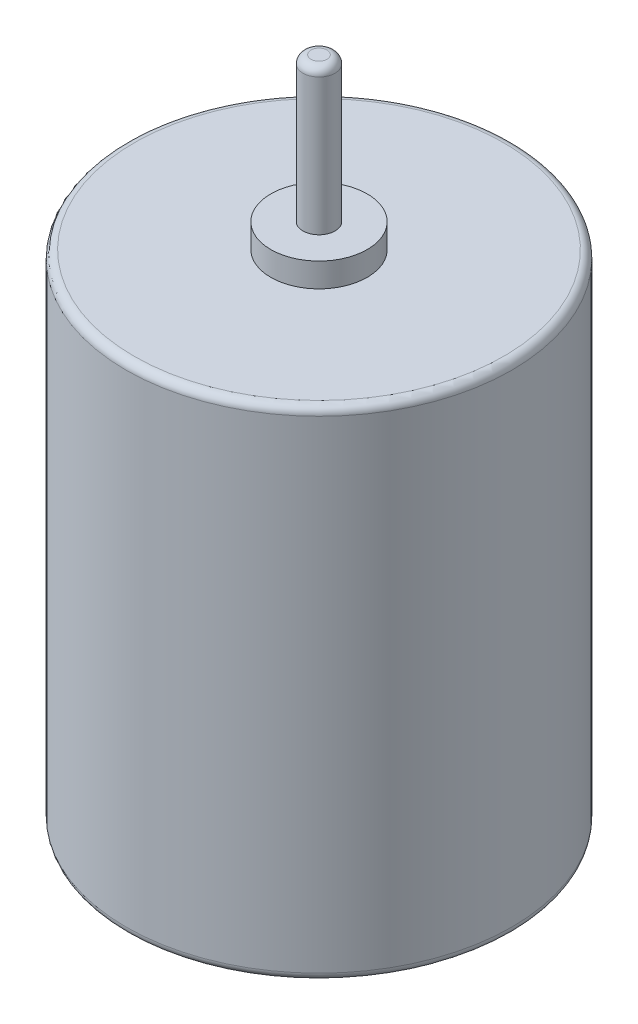
ISO-10303-21;
HEADER;
FILE_DESCRIPTION(('STEP AP214'),'2;1');
FILE_NAME('part.step','',(''),(''),'','','');
FILE_SCHEMA(('AUTOMOTIVE_DESIGN { 1 0 10303 214 1 1 1 1 }'));
ENDSEC;
DATA;
#1=APPLICATION_CONTEXT('core data for automotive mechanical design processes');
#2=APPLICATION_PROTOCOL_DEFINITION('international standard','automotive_design',2000,#1);
#3=PRODUCT_CONTEXT('',#1,'mechanical');
#4=PRODUCT('Part','Part','',(#3));
#5=PRODUCT_RELATED_PRODUCT_CATEGORY('part','',(#4));
#6=PRODUCT_DEFINITION_FORMATION('','',#4);
#7=PRODUCT_DEFINITION_CONTEXT('part definition',#1,'design');
#8=PRODUCT_DEFINITION('design','',#6,#7);
#9=PRODUCT_DEFINITION_SHAPE('','',#8);
#10=(LENGTH_UNIT() NAMED_UNIT(*) SI_UNIT(.MILLI.,.METRE.));
#11=(NAMED_UNIT(*) PLANE_ANGLE_UNIT() SI_UNIT($,.RADIAN.));
#12=(NAMED_UNIT(*) SI_UNIT($,.STERADIAN.) SOLID_ANGLE_UNIT());
#13=UNCERTAINTY_MEASURE_WITH_UNIT(LENGTH_MEASURE(1.E-05),#10,'distance_accuracy_value','');
#14=(GEOMETRIC_REPRESENTATION_CONTEXT(3) GLOBAL_UNCERTAINTY_ASSIGNED_CONTEXT((#13)) GLOBAL_UNIT_ASSIGNED_CONTEXT((#10,
#11,#12)) REPRESENTATION_CONTEXT('',''));
#15=CARTESIAN_POINT('',(0.,0.,0.));
#16=DIRECTION('',(0.,0.,1.));
#17=DIRECTION('',(1.,0.,0.));
#18=AXIS2_PLACEMENT_3D('',#15,#16,#17);
#19=CARTESIAN_POINT('',(0.,31.,0.));
#20=DIRECTION('',(0.,-1.,0.));
#21=DIRECTION('',(0.,0.,-1.));
#22=AXIS2_PLACEMENT_3D('',#19,#20,#21);
#23=CYLINDRICAL_SURFACE('',#22,12.);
#24=CARTESIAN_POINT('',(0.,0.5,0.));
#25=DIRECTION('',(0.,1.,0.));
#26=DIRECTION('',(0.,0.,1.));
#27=AXIS2_PLACEMENT_3D('',#24,#25,#26);
#28=CIRCLE('',#27,12.);
#29=CARTESIAN_POINT('',(0.,0.5,12.));
#30=VERTEX_POINT('',#29);
#31=EDGE_CURVE('E61',#30,#30,#28,.T.);
#32=ORIENTED_EDGE('',*,*,#31,.T.);
#33=EDGE_LOOP('',(#32));
#34=FACE_BOUND('',#33,.T.);
#35=CARTESIAN_POINT('',(0.,30.5,0.));
#36=DIRECTION('',(0.,1.,0.));
#37=DIRECTION('',(0.,0.,1.));
#38=AXIS2_PLACEMENT_3D('',#35,#36,#37);
#39=CIRCLE('',#38,12.);
#40=CARTESIAN_POINT('',(0.,30.5,12.));
#41=VERTEX_POINT('',#40);
#42=EDGE_CURVE('E64',#41,#41,#39,.F.);
#43=ORIENTED_EDGE('',*,*,#42,.T.);
#44=EDGE_LOOP('',(#43));
#45=FACE_BOUND('',#44,.T.);
#46=ADVANCED_FACE('F31',(#34,#45),#23,.T.);
#47=CARTESIAN_POINT('',(0.,31.,0.));
#48=DIRECTION('',(0.,1.,0.));
#49=DIRECTION('',(0.,0.,1.));
#50=AXIS2_PLACEMENT_3D('',#47,#48,#49);
#51=PLANE('',#50);
#52=CARTESIAN_POINT('',(0.,31.,0.));
#53=DIRECTION('',(0.,1.,0.));
#54=DIRECTION('',(0.,0.,1.));
#55=AXIS2_PLACEMENT_3D('',#52,#53,#54);
#56=CIRCLE('',#55,11.5);
#57=CARTESIAN_POINT('',(0.,31.,11.5));
#58=VERTEX_POINT('',#57);
#59=EDGE_CURVE('E55',#58,#58,#56,.T.);
#60=ORIENTED_EDGE('',*,*,#59,.T.);
#61=EDGE_LOOP('',(#60));
#62=FACE_BOUND('',#61,.T.);
#63=CARTESIAN_POINT('',(0.,31.,0.));
#64=DIRECTION('',(0.,1.,0.));
#65=DIRECTION('',(0.,0.,1.));
#66=AXIS2_PLACEMENT_3D('',#63,#64,#65);
#67=CIRCLE('',#66,3.);
#68=CARTESIAN_POINT('',(0.,31.,3.));
#69=VERTEX_POINT('',#68);
#70=EDGE_CURVE('E74',#69,#69,#67,.T.);
#71=ORIENTED_EDGE('',*,*,#70,.F.);
#72=EDGE_LOOP('',(#71));
#73=FACE_BOUND('',#72,.T.);
#74=ADVANCED_FACE('F101',(#62,#73),#51,.T.);
#75=CARTESIAN_POINT('',(0.,0.,0.));
#76=DIRECTION('',(0.,1.,0.));
#77=DIRECTION('',(0.,0.,1.));
#78=AXIS2_PLACEMENT_3D('',#75,#76,#77);
#79=PLANE('',#78);
#80=CARTESIAN_POINT('',(0.,0.,0.));
#81=DIRECTION('',(0.,1.,0.));
#82=DIRECTION('',(0.,0.,1.));
#83=AXIS2_PLACEMENT_3D('',#80,#81,#82);
#84=CIRCLE('',#83,4.5);
#85=CARTESIAN_POINT('',(0.,0.,4.5));
#86=VERTEX_POINT('',#85);
#87=EDGE_CURVE('E52',#86,#86,#84,.F.);
#88=ORIENTED_EDGE('',*,*,#87,.F.);
#89=EDGE_LOOP('',(#88));
#90=FACE_BOUND('',#89,.T.);
#91=CARTESIAN_POINT('',(0.,0.,0.));
#92=DIRECTION('',(0.,1.,0.));
#93=DIRECTION('',(0.,0.,1.));
#94=AXIS2_PLACEMENT_3D('',#91,#92,#93);
#95=CIRCLE('',#94,11.5);
#96=CARTESIAN_POINT('',(0.,0.,11.5));
#97=VERTEX_POINT('',#96);
#98=EDGE_CURVE('E58',#97,#97,#95,.F.);
#99=ORIENTED_EDGE('',*,*,#98,.T.);
#100=EDGE_LOOP('',(#99));
#101=FACE_BOUND('',#100,.T.);
#102=ADVANCED_FACE('F107',(#90,#101),#79,.F.);
#103=CARTESIAN_POINT('',(0.,32.5,0.));
#104=DIRECTION('',(0.,-1.,0.));
#105=DIRECTION('',(0.,0.,-1.));
#106=AXIS2_PLACEMENT_3D('',#103,#104,#105);
#107=CYLINDRICAL_SURFACE('',#106,3.);
#108=CARTESIAN_POINT('',(0.,32.5,0.));
#109=DIRECTION('',(0.,1.,0.));
#110=DIRECTION('',(0.,0.,1.));
#111=AXIS2_PLACEMENT_3D('',#108,#109,#110);
#112=CIRCLE('',#111,3.);
#113=CARTESIAN_POINT('',(0.,32.5,3.));
#114=VERTEX_POINT('',#113);
#115=EDGE_CURVE('E77',#114,#114,#112,.T.);
#116=ORIENTED_EDGE('',*,*,#115,.F.);
#117=EDGE_LOOP('',(#116));
#118=FACE_BOUND('',#117,.T.);
#119=ORIENTED_EDGE('',*,*,#70,.T.);
#120=EDGE_LOOP('',(#119));
#121=FACE_BOUND('',#120,.T.);
#122=ADVANCED_FACE('F162',(#118,#121),#107,.T.);
#123=CARTESIAN_POINT('',(0.,32.5,0.));
#124=DIRECTION('',(0.,1.,0.));
#125=DIRECTION('',(0.,0.,1.));
#126=AXIS2_PLACEMENT_3D('',#123,#124,#125);
#127=PLANE('',#126);
#128=CARTESIAN_POINT('',(0.,32.5,0.));
#129=DIRECTION('',(0.,1.,0.));
#130=DIRECTION('',(0.,0.,1.));
#131=AXIS2_PLACEMENT_3D('',#128,#129,#130);
#132=CIRCLE('',#131,1.);
#133=CARTESIAN_POINT('',(0.,32.5,1.));
#134=VERTEX_POINT('',#133);
#135=EDGE_CURVE('E73',#134,#134,#132,.T.);
#136=ORIENTED_EDGE('',*,*,#135,.F.);
#137=EDGE_LOOP('',(#136));
#138=FACE_BOUND('',#137,.T.);
#139=ORIENTED_EDGE('',*,*,#115,.T.);
#140=EDGE_LOOP('',(#139));
#141=FACE_BOUND('',#140,.T.);
#142=ADVANCED_FACE('F208',(#138,#141),#127,.T.);
#143=CARTESIAN_POINT('',(0.,41.5,0.));
#144=DIRECTION('',(0.,-1.,0.));
#145=DIRECTION('',(0.,0.,-1.));
#146=AXIS2_PLACEMENT_3D('',#143,#144,#145);
#147=CYLINDRICAL_SURFACE('',#146,1.);
#148=CARTESIAN_POINT('',(0.,41.,0.));
#149=DIRECTION('',(0.,1.,0.));
#150=DIRECTION('',(0.,0.,1.));
#151=AXIS2_PLACEMENT_3D('',#148,#149,#150);
#152=CIRCLE('',#151,1.);
#153=CARTESIAN_POINT('',(0.,41.,1.));
#154=VERTEX_POINT('',#153);
#155=EDGE_CURVE('E67',#154,#154,#152,.F.);
#156=ORIENTED_EDGE('',*,*,#155,.T.);
#157=EDGE_LOOP('',(#156));
#158=FACE_BOUND('',#157,.T.);
#159=ORIENTED_EDGE('',*,*,#135,.T.);
#160=EDGE_LOOP('',(#159));
#161=FACE_BOUND('',#160,.T.);
#162=ADVANCED_FACE('F198',(#158,#161),#147,.T.);
#163=CARTESIAN_POINT('',(0.,41.5,0.));
#164=DIRECTION('',(0.,1.,0.));
#165=DIRECTION('',(0.,0.,1.));
#166=AXIS2_PLACEMENT_3D('',#163,#164,#165);
#167=PLANE('',#166);
#168=CARTESIAN_POINT('',(0.,41.5,0.));
#169=DIRECTION('',(0.,1.,0.));
#170=DIRECTION('',(0.,0.,1.));
#171=AXIS2_PLACEMENT_3D('',#168,#169,#170);
#172=CIRCLE('',#171,0.5);
#173=CARTESIAN_POINT('',(0.,41.5,0.5));
#174=VERTEX_POINT('',#173);
#175=EDGE_CURVE('E70',#174,#174,#172,.T.);
#176=ORIENTED_EDGE('',*,*,#175,.T.);
#177=EDGE_LOOP('',(#176));
#178=FACE_BOUND('',#177,.T.);
#179=ADVANCED_FACE('F117',(#178),#167,.T.);
#180=CARTESIAN_POINT('',(0.,41.,0.));
#181=DIRECTION('',(0.,1.,0.));
#182=DIRECTION('',(0.,0.,1.));
#183=AXIS2_PLACEMENT_3D('',#180,#181,#182);
#184=DEGENERATE_TOROIDAL_SURFACE('',#183,0.5,0.5,.T.);
#185=ORIENTED_EDGE('',*,*,#155,.F.);
#186=EDGE_LOOP('',(#185));
#187=FACE_BOUND('',#186,.T.);
#188=ORIENTED_EDGE('',*,*,#175,.F.);
#189=EDGE_LOOP('',(#188));
#190=FACE_BOUND('',#189,.T.);
#191=ADVANCED_FACE('F113',(#187,#190),#184,.T.);
#192=CARTESIAN_POINT('',(0.,0.5,0.));
#193=DIRECTION('',(0.,1.,0.));
#194=DIRECTION('',(0.,0.,1.));
#195=AXIS2_PLACEMENT_3D('',#192,#193,#194);
#196=TOROIDAL_SURFACE('',#195,11.5,0.5);
#197=ORIENTED_EDGE('',*,*,#98,.F.);
#198=EDGE_LOOP('',(#197));
#199=FACE_BOUND('',#198,.T.);
#200=ORIENTED_EDGE('',*,*,#31,.F.);
#201=EDGE_LOOP('',(#200));
#202=FACE_BOUND('',#201,.T.);
#203=ADVANCED_FACE('F116',(#199,#202),#196,.T.);
#204=CARTESIAN_POINT('',(0.,30.5,0.));
#205=DIRECTION('',(0.,1.,0.));
#206=DIRECTION('',(0.,0.,1.));
#207=AXIS2_PLACEMENT_3D('',#204,#205,#206);
#208=TOROIDAL_SURFACE('',#207,11.5,0.5);
#209=ORIENTED_EDGE('',*,*,#42,.F.);
#210=EDGE_LOOP('',(#209));
#211=FACE_BOUND('',#210,.T.);
#212=ORIENTED_EDGE('',*,*,#59,.F.);
#213=EDGE_LOOP('',(#212));
#214=FACE_BOUND('',#213,.T.);
#215=ADVANCED_FACE('F98',(#211,#214),#208,.T.);
#216=CARTESIAN_POINT('',(0.,-2.,0.));
#217=DIRECTION('',(0.,1.,0.));
#218=DIRECTION('',(0.,0.,1.));
#219=AXIS2_PLACEMENT_3D('',#216,#217,#218);
#220=CYLINDRICAL_SURFACE('',#219,4.5);
#221=CARTESIAN_POINT('',(0.,-1.5,0.));
#222=DIRECTION('',(0.,-1.,0.));
#223=DIRECTION('',(0.,0.,-1.));
#224=AXIS2_PLACEMENT_3D('',#221,#222,#223);
#225=CIRCLE('',#224,4.5);
#226=CARTESIAN_POINT('',(0.,-1.5,-4.5));
#227=VERTEX_POINT('',#226);
#228=EDGE_CURVE('E10',#227,#227,#225,.F.);
#229=ORIENTED_EDGE('',*,*,#228,.T.);
#230=EDGE_LOOP('',(#229));
#231=FACE_BOUND('',#230,.T.);
#232=ORIENTED_EDGE('',*,*,#87,.T.);
#233=EDGE_LOOP('',(#232));
#234=FACE_BOUND('',#233,.T.);
#235=ADVANCED_FACE('F89',(#231,#234),#220,.T.);
#236=CARTESIAN_POINT('',(0.,-2.,0.));
#237=DIRECTION('',(0.,-1.,0.));
#238=DIRECTION('',(0.,0.,-1.));
#239=AXIS2_PLACEMENT_3D('',#236,#237,#238);
#240=PLANE('',#239);
#241=CARTESIAN_POINT('',(0.,-2.,0.));
#242=DIRECTION('',(0.,-1.,0.));
#243=DIRECTION('',(0.,0.,-1.));
#244=AXIS2_PLACEMENT_3D('',#241,#242,#243);
#245=CIRCLE('',#244,4.);
#246=CARTESIAN_POINT('',(0.,-2.,-4.));
#247=VERTEX_POINT('',#246);
#248=EDGE_CURVE('E38',#247,#247,#245,.T.);
#249=ORIENTED_EDGE('',*,*,#248,.T.);
#250=EDGE_LOOP('',(#249));
#251=FACE_BOUND('',#250,.T.);
#252=CARTESIAN_POINT('',(0.,-2.,0.));
#253=DIRECTION('',(0.,-1.,0.));
#254=DIRECTION('',(0.,0.,-1.));
#255=AXIS2_PLACEMENT_3D('',#252,#253,#254);
#256=CIRCLE('',#255,1.);
#257=CARTESIAN_POINT('',(0.,-2.,-1.));
#258=VERTEX_POINT('',#257);
#259=EDGE_CURVE('E51',#258,#258,#256,.T.);
#260=ORIENTED_EDGE('',*,*,#259,.F.);
#261=EDGE_LOOP('',(#260));
#262=FACE_BOUND('',#261,.T.);
#263=ADVANCED_FACE('F87',(#251,#262),#240,.T.);
#264=CARTESIAN_POINT('',(0.,-3.,0.));
#265=DIRECTION('',(0.,1.,0.));
#266=DIRECTION('',(0.,0.,1.));
#267=AXIS2_PLACEMENT_3D('',#264,#265,#266);
#268=CYLINDRICAL_SURFACE('',#267,1.);
#269=CARTESIAN_POINT('',(0.,-2.5,0.));
#270=DIRECTION('',(0.,-1.,0.));
#271=DIRECTION('',(0.,0.,-1.));
#272=AXIS2_PLACEMENT_3D('',#269,#270,#271);
#273=CIRCLE('',#272,1.);
#274=CARTESIAN_POINT('',(0.,-2.5,-1.));
#275=VERTEX_POINT('',#274);
#276=EDGE_CURVE('E42',#275,#275,#273,.F.);
#277=ORIENTED_EDGE('',*,*,#276,.T.);
#278=EDGE_LOOP('',(#277));
#279=FACE_BOUND('',#278,.T.);
#280=ORIENTED_EDGE('',*,*,#259,.T.);
#281=EDGE_LOOP('',(#280));
#282=FACE_BOUND('',#281,.T.);
#283=ADVANCED_FACE('F85',(#279,#282),#268,.T.);
#284=CARTESIAN_POINT('',(0.,-3.,0.));
#285=DIRECTION('',(0.,-1.,0.));
#286=DIRECTION('',(0.,0.,-1.));
#287=AXIS2_PLACEMENT_3D('',#284,#285,#286);
#288=PLANE('',#287);
#289=CARTESIAN_POINT('',(0.,-3.,0.));
#290=DIRECTION('',(0.,-1.,0.));
#291=DIRECTION('',(0.,0.,-1.));
#292=AXIS2_PLACEMENT_3D('',#289,#290,#291);
#293=CIRCLE('',#292,0.5);
#294=CARTESIAN_POINT('',(0.,-3.,-0.5));
#295=VERTEX_POINT('',#294);
#296=EDGE_CURVE('E46',#295,#295,#293,.T.);
#297=ORIENTED_EDGE('',*,*,#296,.T.);
#298=EDGE_LOOP('',(#297));
#299=FACE_BOUND('',#298,.T.);
#300=ADVANCED_FACE('F95',(#299),#288,.T.);
#301=CARTESIAN_POINT('',(0.,-2.5,0.));
#302=DIRECTION('',(0.,-1.,0.));
#303=DIRECTION('',(0.,0.,-1.));
#304=AXIS2_PLACEMENT_3D('',#301,#302,#303);
#305=DEGENERATE_TOROIDAL_SURFACE('',#304,0.5,0.5,.T.);
#306=ORIENTED_EDGE('',*,*,#276,.F.);
#307=EDGE_LOOP('',(#306));
#308=FACE_BOUND('',#307,.T.);
#309=ORIENTED_EDGE('',*,*,#296,.F.);
#310=EDGE_LOOP('',(#309));
#311=FACE_BOUND('',#310,.T.);
#312=ADVANCED_FACE('F124',(#308,#311),#305,.T.);
#313=CARTESIAN_POINT('',(0.,-1.5,0.));
#314=DIRECTION('',(0.,-1.,0.));
#315=DIRECTION('',(0.,0.,-1.));
#316=AXIS2_PLACEMENT_3D('',#313,#314,#315);
#317=TOROIDAL_SURFACE('',#316,4.,0.5);
#318=ORIENTED_EDGE('',*,*,#228,.F.);
#319=EDGE_LOOP('',(#318));
#320=FACE_BOUND('',#319,.T.);
#321=ORIENTED_EDGE('',*,*,#248,.F.);
#322=EDGE_LOOP('',(#321));
#323=FACE_BOUND('',#322,.T.);
#324=ADVANCED_FACE('F33',(#320,#323),#317,.T.);
#325=CLOSED_SHELL('',(#46,#74,#102,#122,#142,#162,#179,#191,#203,#215,#235,#263,#283,#300,#312,#324));
#326=MANIFOLD_SOLID_BREP('B2',#325);
#327=ADVANCED_BREP_SHAPE_REPRESENTATION('',(#18,#326),#14);
#328=SHAPE_DEFINITION_REPRESENTATION(#9,#327);
ENDSEC;
END-ISO-10303-21;
